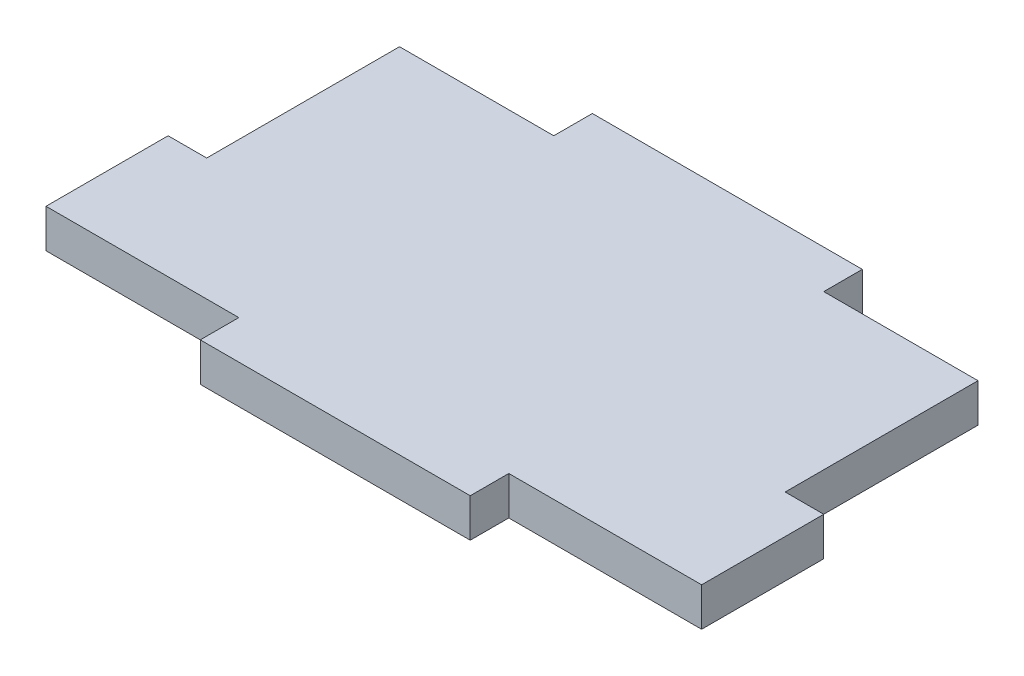
ISO-10303-21;
HEADER;
FILE_DESCRIPTION(('STEP AP214'),'2;1');
FILE_NAME('part.step','',(''),(''),'','','');
FILE_SCHEMA(('AUTOMOTIVE_DESIGN { 1 0 10303 214 1 1 1 1 }'));
ENDSEC;
DATA;
#1=APPLICATION_CONTEXT('core data for automotive mechanical design processes');
#2=APPLICATION_PROTOCOL_DEFINITION('international standard','automotive_design',2000,#1);
#3=PRODUCT_CONTEXT('',#1,'mechanical');
#4=PRODUCT('Part','Part','',(#3));
#5=PRODUCT_RELATED_PRODUCT_CATEGORY('part','',(#4));
#6=PRODUCT_DEFINITION_FORMATION('','',#4);
#7=PRODUCT_DEFINITION_CONTEXT('part definition',#1,'design');
#8=PRODUCT_DEFINITION('design','',#6,#7);
#9=PRODUCT_DEFINITION_SHAPE('','',#8);
#10=(LENGTH_UNIT() NAMED_UNIT(*) SI_UNIT(.MILLI.,.METRE.));
#11=(NAMED_UNIT(*) PLANE_ANGLE_UNIT() SI_UNIT($,.RADIAN.));
#12=(NAMED_UNIT(*) SI_UNIT($,.STERADIAN.) SOLID_ANGLE_UNIT());
#13=UNCERTAINTY_MEASURE_WITH_UNIT(LENGTH_MEASURE(1.E-05),#10,'distance_accuracy_value','');
#14=(GEOMETRIC_REPRESENTATION_CONTEXT(3) GLOBAL_UNCERTAINTY_ASSIGNED_CONTEXT((#13)) GLOBAL_UNIT_ASSIGNED_CONTEXT((#10,
#11,#12)) REPRESENTATION_CONTEXT('',''));
#15=CARTESIAN_POINT('',(0.,0.,0.));
#16=DIRECTION('',(0.,0.,1.));
#17=DIRECTION('',(1.,0.,0.));
#18=AXIS2_PLACEMENT_3D('',#15,#16,#17);
#19=CARTESIAN_POINT('',(-50.,150.,75.));
#20=DIRECTION('',(1.,0.,0.));
#21=DIRECTION('',(0.,0.,-1.));
#22=AXIS2_PLACEMENT_3D('',#19,#20,#21);
#23=PLANE('',#22);
#24=DIRECTION('',(0.,-1.,0.));
#25=VECTOR('',#24,1.);
#26=CARTESIAN_POINT('',(-50.,0.,-39.));
#27=LINE('',#26,#25);
#28=CARTESIAN_POINT('',(-50.,6.,-39.));
#29=VERTEX_POINT('',#28);
#30=CARTESIAN_POINT('',(-50.,0.,-39.));
#31=VERTEX_POINT('',#30);
#32=EDGE_CURVE('E161',#29,#31,#27,.T.);
#33=ORIENTED_EDGE('',*,*,#32,.T.);
#34=DIRECTION('',(0.,0.,1.));
#35=VECTOR('',#34,1.);
#36=CARTESIAN_POINT('',(-50.,0.,75.));
#37=LINE('',#36,#35);
#38=CARTESIAN_POINT('',(-50.,0.,-20.));
#39=VERTEX_POINT('',#38);
#40=EDGE_CURVE('E11',#31,#39,#37,.T.);
#41=ORIENTED_EDGE('',*,*,#40,.T.);
#42=DIRECTION('',(0.,1.,0.));
#43=VECTOR('',#42,1.);
#44=CARTESIAN_POINT('',(-50.,150.,-20.));
#45=LINE('',#44,#43);
#46=CARTESIAN_POINT('',(-50.,6.,-20.));
#47=VERTEX_POINT('',#46);
#48=EDGE_CURVE('E207',#39,#47,#45,.T.);
#49=ORIENTED_EDGE('',*,*,#48,.T.);
#50=DIRECTION('',(0.,0.,1.));
#51=VECTOR('',#50,1.);
#52=CARTESIAN_POINT('',(-50.,6.,-75.));
#53=LINE('',#52,#51);
#54=EDGE_CURVE('E198',#29,#47,#53,.T.);
#55=ORIENTED_EDGE('',*,*,#54,.F.);
#56=EDGE_LOOP('',(#33,#41,#49,#55));
#57=FACE_BOUND('',#56,.T.);
#58=ADVANCED_FACE('F41',(#57),#23,.F.);
#59=CARTESIAN_POINT('',(0.,0.,0.));
#60=DIRECTION('',(0.,-1.,0.));
#61=DIRECTION('',(0.,0.,-1.));
#62=AXIS2_PLACEMENT_3D('',#59,#60,#61);
#63=PLANE('',#62);
#64=ORIENTED_EDGE('',*,*,#40,.F.);
#65=DIRECTION('',(-1.,0.,0.));
#66=VECTOR('',#65,1.);
#67=CARTESIAN_POINT('',(-44.,0.,-39.));
#68=LINE('',#67,#66);
#69=CARTESIAN_POINT('',(-44.,0.,-39.));
#70=VERTEX_POINT('',#69);
#71=EDGE_CURVE('E169',#70,#31,#68,.T.);
#72=ORIENTED_EDGE('',*,*,#71,.F.);
#73=DIRECTION('',(0.,0.,-1.));
#74=VECTOR('',#73,1.);
#75=CARTESIAN_POINT('',(-44.,0.,-69.));
#76=LINE('',#75,#74);
#77=CARTESIAN_POINT('',(-44.,0.,-69.));
#78=VERTEX_POINT('',#77);
#79=EDGE_CURVE('E156',#70,#78,#76,.T.);
#80=ORIENTED_EDGE('',*,*,#79,.T.);
#81=DIRECTION('',(-1.,0.,0.));
#82=VECTOR('',#81,1.);
#83=CARTESIAN_POINT('',(-50.,0.,-69.));
#84=LINE('',#83,#82);
#85=CARTESIAN_POINT('',(-20.,0.,-69.));
#86=VERTEX_POINT('',#85);
#87=EDGE_CURVE('E168',#86,#78,#84,.T.);
#88=ORIENTED_EDGE('',*,*,#87,.F.);
#89=DIRECTION('',(0.,0.,-1.));
#90=VECTOR('',#89,1.);
#91=CARTESIAN_POINT('',(-20.,0.,-69.));
#92=LINE('',#91,#90);
#93=CARTESIAN_POINT('',(-20.,0.,-75.));
#94=VERTEX_POINT('',#93);
#95=EDGE_CURVE('E178',#86,#94,#92,.T.);
#96=ORIENTED_EDGE('',*,*,#95,.T.);
#97=DIRECTION('',(-1.,0.,0.));
#98=VECTOR('',#97,1.);
#99=CARTESIAN_POINT('',(-50.,0.,-75.));
#100=LINE('',#99,#98);
#101=CARTESIAN_POINT('',(22.,0.,-75.));
#102=VERTEX_POINT('',#101);
#103=EDGE_CURVE('E49',#102,#94,#100,.T.);
#104=ORIENTED_EDGE('',*,*,#103,.F.);
#105=DIRECTION('',(0.,0.,-1.));
#106=VECTOR('',#105,1.);
#107=CARTESIAN_POINT('',(22.,0.,-69.));
#108=LINE('',#107,#106);
#109=CARTESIAN_POINT('',(22.,0.,-69.));
#110=VERTEX_POINT('',#109);
#111=EDGE_CURVE('E220',#110,#102,#108,.T.);
#112=ORIENTED_EDGE('',*,*,#111,.F.);
#113=DIRECTION('',(-1.,0.,0.));
#114=VECTOR('',#113,1.);
#115=CARTESIAN_POINT('',(52.,0.,-69.));
#116=LINE('',#115,#114);
#117=CARTESIAN_POINT('',(46.,0.,-69.));
#118=VERTEX_POINT('',#117);
#119=EDGE_CURVE('E238',#118,#110,#116,.T.);
#120=ORIENTED_EDGE('',*,*,#119,.F.);
#121=DIRECTION('',(0.,0.,-1.));
#122=VECTOR('',#121,1.);
#123=CARTESIAN_POINT('',(46.,0.,-69.));
#124=LINE('',#123,#122);
#125=CARTESIAN_POINT('',(46.,0.,-39.));
#126=VERTEX_POINT('',#125);
#127=EDGE_CURVE('E64',#126,#118,#124,.T.);
#128=ORIENTED_EDGE('',*,*,#127,.F.);
#129=DIRECTION('',(1.,0.,0.));
#130=VECTOR('',#129,1.);
#131=CARTESIAN_POINT('',(46.,0.,-39.));
#132=LINE('',#131,#130);
#133=CARTESIAN_POINT('',(52.,0.,-39.));
#134=VERTEX_POINT('',#133);
#135=EDGE_CURVE('E262',#126,#134,#132,.T.);
#136=ORIENTED_EDGE('',*,*,#135,.T.);
#137=DIRECTION('',(0.,0.,-1.));
#138=VECTOR('',#137,1.);
#139=CARTESIAN_POINT('',(52.,0.,-20.));
#140=LINE('',#139,#138);
#141=CARTESIAN_POINT('',(52.,0.,-20.));
#142=VERTEX_POINT('',#141);
#143=EDGE_CURVE('E192',#142,#134,#140,.T.);
#144=ORIENTED_EDGE('',*,*,#143,.F.);
#145=DIRECTION('',(1.,0.,0.));
#146=VECTOR('',#145,1.);
#147=CARTESIAN_POINT('',(-50.001,0.,-20.));
#148=LINE('',#147,#146);
#149=CARTESIAN_POINT('',(22.,0.,-20.));
#150=VERTEX_POINT('',#149);
#151=EDGE_CURVE('E210',#150,#142,#148,.T.);
#152=ORIENTED_EDGE('',*,*,#151,.F.);
#153=DIRECTION('',(0.,0.,-1.));
#154=VECTOR('',#153,1.);
#155=CARTESIAN_POINT('',(22.,0.,-14.));
#156=LINE('',#155,#154);
#157=CARTESIAN_POINT('',(22.,0.,-14.));
#158=VERTEX_POINT('',#157);
#159=EDGE_CURVE('E245',#158,#150,#156,.T.);
#160=ORIENTED_EDGE('',*,*,#159,.F.);
#161=DIRECTION('',(1.,0.,0.));
#162=VECTOR('',#161,1.);
#163=CARTESIAN_POINT('',(-20.,0.,-14.));
#164=LINE('',#163,#162);
#165=CARTESIAN_POINT('',(-20.,0.,-14.));
#166=VERTEX_POINT('',#165);
#167=EDGE_CURVE('E266',#166,#158,#164,.T.);
#168=ORIENTED_EDGE('',*,*,#167,.F.);
#169=DIRECTION('',(0.,0.,-1.));
#170=VECTOR('',#169,1.);
#171=CARTESIAN_POINT('',(-20.,0.,-14.));
#172=LINE('',#171,#170);
#173=CARTESIAN_POINT('',(-20.,0.,-20.));
#174=VERTEX_POINT('',#173);
#175=EDGE_CURVE('E186',#166,#174,#172,.T.);
#176=ORIENTED_EDGE('',*,*,#175,.T.);
#177=EDGE_CURVE('E211',#39,#174,#148,.T.);
#178=ORIENTED_EDGE('',*,*,#177,.F.);
#179=EDGE_LOOP('',(#64,#72,#80,#88,#96,#104,#112,#120,#128,#136,#144,#152,#160,#168,#176,#178));
#180=FACE_BOUND('',#179,.T.);
#181=ADVANCED_FACE('F166',(#180),#63,.T.);
#182=CARTESIAN_POINT('',(0.,6.,0.));
#183=DIRECTION('',(0.,1.,0.));
#184=DIRECTION('',(0.,0.,1.));
#185=AXIS2_PLACEMENT_3D('',#182,#183,#184);
#186=PLANE('',#185);
#187=DIRECTION('',(0.,0.,1.));
#188=VECTOR('',#187,1.);
#189=CARTESIAN_POINT('',(-44.,6.,-69.));
#190=LINE('',#189,#188);
#191=CARTESIAN_POINT('',(-44.,6.,-69.));
#192=VERTEX_POINT('',#191);
#193=CARTESIAN_POINT('',(-44.,6.,-39.));
#194=VERTEX_POINT('',#193);
#195=EDGE_CURVE('E56',#192,#194,#190,.T.);
#196=ORIENTED_EDGE('',*,*,#195,.T.);
#197=DIRECTION('',(-1.,0.,0.));
#198=VECTOR('',#197,1.);
#199=CARTESIAN_POINT('',(-44.,6.,-39.));
#200=LINE('',#199,#198);
#201=EDGE_CURVE('E277',#194,#29,#200,.T.);
#202=ORIENTED_EDGE('',*,*,#201,.T.);
#203=ORIENTED_EDGE('',*,*,#54,.T.);
#204=DIRECTION('',(1.,0.,0.));
#205=VECTOR('',#204,1.);
#206=CARTESIAN_POINT('',(-50.,6.,-20.));
#207=LINE('',#206,#205);
#208=CARTESIAN_POINT('',(-20.,6.,-20.));
#209=VERTEX_POINT('',#208);
#210=EDGE_CURVE('E201',#47,#209,#207,.T.);
#211=ORIENTED_EDGE('',*,*,#210,.T.);
#212=DIRECTION('',(0.,0.,-1.));
#213=VECTOR('',#212,1.);
#214=CARTESIAN_POINT('',(-20.,6.,-14.));
#215=LINE('',#214,#213);
#216=CARTESIAN_POINT('',(-20.,6.,-14.));
#217=VERTEX_POINT('',#216);
#218=EDGE_CURVE('E251',#217,#209,#215,.T.);
#219=ORIENTED_EDGE('',*,*,#218,.F.);
#220=DIRECTION('',(-1.,0.,0.));
#221=VECTOR('',#220,1.);
#222=CARTESIAN_POINT('',(-20.,6.,-14.));
#223=LINE('',#222,#221);
#224=CARTESIAN_POINT('',(22.,6.,-14.));
#225=VERTEX_POINT('',#224);
#226=EDGE_CURVE('E254',#225,#217,#223,.T.);
#227=ORIENTED_EDGE('',*,*,#226,.F.);
#228=DIRECTION('',(0.,0.,-1.));
#229=VECTOR('',#228,1.);
#230=CARTESIAN_POINT('',(22.,6.,-14.));
#231=LINE('',#230,#229);
#232=CARTESIAN_POINT('',(22.,6.,-20.));
#233=VERTEX_POINT('',#232);
#234=EDGE_CURVE('E248',#225,#233,#231,.T.);
#235=ORIENTED_EDGE('',*,*,#234,.T.);
#236=CARTESIAN_POINT('',(52.,6.,-20.));
#237=VERTEX_POINT('',#236);
#238=EDGE_CURVE('E200',#233,#237,#207,.T.);
#239=ORIENTED_EDGE('',*,*,#238,.T.);
#240=DIRECTION('',(0.,0.,1.));
#241=VECTOR('',#240,1.);
#242=CARTESIAN_POINT('',(52.,6.,-20.));
#243=LINE('',#242,#241);
#244=CARTESIAN_POINT('',(52.,6.,-39.));
#245=VERTEX_POINT('',#244);
#246=EDGE_CURVE('E196',#245,#237,#243,.T.);
#247=ORIENTED_EDGE('',*,*,#246,.F.);
#248=DIRECTION('',(1.,0.,0.));
#249=VECTOR('',#248,1.);
#250=CARTESIAN_POINT('',(46.,6.,-39.));
#251=LINE('',#250,#249);
#252=CARTESIAN_POINT('',(46.,6.,-39.));
#253=VERTEX_POINT('',#252);
#254=EDGE_CURVE('E270',#253,#245,#251,.T.);
#255=ORIENTED_EDGE('',*,*,#254,.F.);
#256=DIRECTION('',(0.,0.,1.));
#257=VECTOR('',#256,1.);
#258=CARTESIAN_POINT('',(46.,6.,-69.));
#259=LINE('',#258,#257);
#260=CARTESIAN_POINT('',(46.,6.,-69.));
#261=VERTEX_POINT('',#260);
#262=EDGE_CURVE('E281',#261,#253,#259,.T.);
#263=ORIENTED_EDGE('',*,*,#262,.F.);
#264=DIRECTION('',(1.,0.,0.));
#265=VECTOR('',#264,1.);
#266=CARTESIAN_POINT('',(52.,6.,-69.));
#267=LINE('',#266,#265);
#268=CARTESIAN_POINT('',(22.,6.,-69.));
#269=VERTEX_POINT('',#268);
#270=EDGE_CURVE('E230',#269,#261,#267,.T.);
#271=ORIENTED_EDGE('',*,*,#270,.F.);
#272=DIRECTION('',(0.,0.,-1.));
#273=VECTOR('',#272,1.);
#274=CARTESIAN_POINT('',(22.,6.,-69.));
#275=LINE('',#274,#273);
#276=CARTESIAN_POINT('',(22.,6.,-75.));
#277=VERTEX_POINT('',#276);
#278=EDGE_CURVE('E193',#269,#277,#275,.T.);
#279=ORIENTED_EDGE('',*,*,#278,.T.);
#280=DIRECTION('',(-1.,0.,0.));
#281=VECTOR('',#280,1.);
#282=CARTESIAN_POINT('',(-50.,6.,-75.));
#283=LINE('',#282,#281);
#284=CARTESIAN_POINT('',(-20.,6.,-75.));
#285=VERTEX_POINT('',#284);
#286=EDGE_CURVE('E204',#277,#285,#283,.T.);
#287=ORIENTED_EDGE('',*,*,#286,.T.);
#288=DIRECTION('',(0.,0.,-1.));
#289=VECTOR('',#288,1.);
#290=CARTESIAN_POINT('',(-20.,6.,-69.));
#291=LINE('',#290,#289);
#292=CARTESIAN_POINT('',(-20.,6.,-69.));
#293=VERTEX_POINT('',#292);
#294=EDGE_CURVE('E176',#293,#285,#291,.T.);
#295=ORIENTED_EDGE('',*,*,#294,.F.);
#296=DIRECTION('',(1.,0.,0.));
#297=VECTOR('',#296,1.);
#298=CARTESIAN_POINT('',(-50.,6.,-69.));
#299=LINE('',#298,#297);
#300=EDGE_CURVE('E180',#192,#293,#299,.T.);
#301=ORIENTED_EDGE('',*,*,#300,.F.);
#302=EDGE_LOOP('',(#196,#202,#203,#211,#219,#227,#235,#239,#247,#255,#263,#271,#279,#287,#295,#301));
#303=FACE_BOUND('',#302,.T.);
#304=ADVANCED_FACE('F225',(#303),#186,.T.);
#305=CARTESIAN_POINT('',(0.,0.,-69.));
#306=DIRECTION('',(0.,0.,-1.));
#307=DIRECTION('',(-1.,0.,0.));
#308=AXIS2_PLACEMENT_3D('',#305,#306,#307);
#309=PLANE('',#308);
#310=ORIENTED_EDGE('',*,*,#87,.T.);
#311=DIRECTION('',(0.,1.,0.));
#312=VECTOR('',#311,1.);
#313=CARTESIAN_POINT('',(-44.,0.,-69.));
#314=LINE('',#313,#312);
#315=EDGE_CURVE('E153',#78,#192,#314,.T.);
#316=ORIENTED_EDGE('',*,*,#315,.T.);
#317=ORIENTED_EDGE('',*,*,#300,.T.);
#318=DIRECTION('',(0.,-1.,0.));
#319=VECTOR('',#318,1.);
#320=CARTESIAN_POINT('',(-20.,0.,-69.));
#321=LINE('',#320,#319);
#322=EDGE_CURVE('E175',#293,#86,#321,.T.);
#323=ORIENTED_EDGE('',*,*,#322,.T.);
#324=EDGE_LOOP('',(#310,#316,#317,#323));
#325=FACE_BOUND('',#324,.T.);
#326=ADVANCED_FACE('F173',(#325),#309,.T.);
#327=CARTESIAN_POINT('',(0.,0.,-69.));
#328=DIRECTION('',(0.,0.,-1.));
#329=DIRECTION('',(-1.,0.,0.));
#330=AXIS2_PLACEMENT_3D('',#327,#328,#329);
#331=PLANE('',#330);
#332=ORIENTED_EDGE('',*,*,#270,.T.);
#333=DIRECTION('',(0.,1.,0.));
#334=VECTOR('',#333,1.);
#335=CARTESIAN_POINT('',(46.,0.,-69.));
#336=LINE('',#335,#334);
#337=EDGE_CURVE('E276',#118,#261,#336,.T.);
#338=ORIENTED_EDGE('',*,*,#337,.F.);
#339=ORIENTED_EDGE('',*,*,#119,.T.);
#340=DIRECTION('',(0.,1.,0.));
#341=VECTOR('',#340,1.);
#342=CARTESIAN_POINT('',(22.,6.,-69.));
#343=LINE('',#342,#341);
#344=EDGE_CURVE('E240',#110,#269,#343,.T.);
#345=ORIENTED_EDGE('',*,*,#344,.T.);
#346=EDGE_LOOP('',(#332,#338,#339,#345));
#347=FACE_BOUND('',#346,.T.);
#348=ADVANCED_FACE('F328',(#347),#331,.T.);
#349=CARTESIAN_POINT('',(50.,0.,-20.));
#350=DIRECTION('',(0.,0.,-1.));
#351=DIRECTION('',(-1.,0.,0.));
#352=AXIS2_PLACEMENT_3D('',#349,#350,#351);
#353=PLANE('',#352);
#354=DIRECTION('',(0.,-1.,0.));
#355=VECTOR('',#354,1.);
#356=CARTESIAN_POINT('',(-20.,0.,-20.));
#357=LINE('',#356,#355);
#358=EDGE_CURVE('E259',#209,#174,#357,.T.);
#359=ORIENTED_EDGE('',*,*,#358,.F.);
#360=ORIENTED_EDGE('',*,*,#210,.F.);
#361=ORIENTED_EDGE('',*,*,#48,.F.);
#362=ORIENTED_EDGE('',*,*,#177,.T.);
#363=EDGE_LOOP('',(#359,#360,#361,#362));
#364=FACE_BOUND('',#363,.T.);
#365=ADVANCED_FACE('F299',(#364),#353,.F.);
#366=DIRECTION('',(0.,1.,0.));
#367=VECTOR('',#366,1.);
#368=CARTESIAN_POINT('',(22.,0.,-20.));
#369=LINE('',#368,#367);
#370=EDGE_CURVE('E255',#150,#233,#369,.T.);
#371=ORIENTED_EDGE('',*,*,#370,.F.);
#372=ORIENTED_EDGE('',*,*,#151,.T.);
#373=DIRECTION('',(0.,-1.,0.));
#374=VECTOR('',#373,1.);
#375=CARTESIAN_POINT('',(52.,6.,-20.));
#376=LINE('',#375,#374);
#377=EDGE_CURVE('E189',#237,#142,#376,.T.);
#378=ORIENTED_EDGE('',*,*,#377,.F.);
#379=ORIENTED_EDGE('',*,*,#238,.F.);
#380=EDGE_LOOP('',(#371,#372,#378,#379));
#381=FACE_BOUND('',#380,.T.);
#382=ADVANCED_FACE('F318',(#381),#353,.F.);
#383=CARTESIAN_POINT('',(52.,0.,0.));
#384=DIRECTION('',(1.,0.,0.));
#385=DIRECTION('',(0.,0.,-1.));
#386=AXIS2_PLACEMENT_3D('',#383,#384,#385);
#387=PLANE('',#386);
#388=DIRECTION('',(0.,-1.,0.));
#389=VECTOR('',#388,1.);
#390=CARTESIAN_POINT('',(52.,0.,-39.));
#391=LINE('',#390,#389);
#392=EDGE_CURVE('E274',#245,#134,#391,.T.);
#393=ORIENTED_EDGE('',*,*,#392,.F.);
#394=ORIENTED_EDGE('',*,*,#246,.T.);
#395=ORIENTED_EDGE('',*,*,#377,.T.);
#396=ORIENTED_EDGE('',*,*,#143,.T.);
#397=EDGE_LOOP('',(#393,#394,#395,#396));
#398=FACE_BOUND('',#397,.T.);
#399=ADVANCED_FACE('F322',(#398),#387,.T.);
#400=CARTESIAN_POINT('',(-50.,150.,-75.));
#401=DIRECTION('',(0.,0.,1.));
#402=DIRECTION('',(1.,0.,0.));
#403=AXIS2_PLACEMENT_3D('',#400,#401,#402);
#404=PLANE('',#403);
#405=ORIENTED_EDGE('',*,*,#286,.F.);
#406=DIRECTION('',(0.,1.,0.));
#407=VECTOR('',#406,1.);
#408=CARTESIAN_POINT('',(22.,6.,-75.));
#409=LINE('',#408,#407);
#410=EDGE_CURVE('E187',#102,#277,#409,.T.);
#411=ORIENTED_EDGE('',*,*,#410,.F.);
#412=ORIENTED_EDGE('',*,*,#103,.T.);
#413=DIRECTION('',(0.,-1.,0.));
#414=VECTOR('',#413,1.);
#415=CARTESIAN_POINT('',(-20.,0.,-75.));
#416=LINE('',#415,#414);
#417=EDGE_CURVE('E184',#285,#94,#416,.T.);
#418=ORIENTED_EDGE('',*,*,#417,.F.);
#419=EDGE_LOOP('',(#405,#411,#412,#418));
#420=FACE_BOUND('',#419,.T.);
#421=ADVANCED_FACE('F43',(#420),#404,.F.);
#422=CARTESIAN_POINT('',(22.,6.,-69.));
#423=DIRECTION('',(-1.,0.,0.));
#424=DIRECTION('',(0.,0.,1.));
#425=AXIS2_PLACEMENT_3D('',#422,#423,#424);
#426=PLANE('',#425);
#427=ORIENTED_EDGE('',*,*,#410,.T.);
#428=ORIENTED_EDGE('',*,*,#278,.F.);
#429=ORIENTED_EDGE('',*,*,#344,.F.);
#430=ORIENTED_EDGE('',*,*,#111,.T.);
#431=EDGE_LOOP('',(#427,#428,#429,#430));
#432=FACE_BOUND('',#431,.T.);
#433=ADVANCED_FACE('F329',(#432),#426,.F.);
#434=CARTESIAN_POINT('',(-20.,0.,-69.));
#435=DIRECTION('',(1.,0.,0.));
#436=DIRECTION('',(0.,0.,-1.));
#437=AXIS2_PLACEMENT_3D('',#434,#435,#436);
#438=PLANE('',#437);
#439=ORIENTED_EDGE('',*,*,#417,.T.);
#440=ORIENTED_EDGE('',*,*,#95,.F.);
#441=ORIENTED_EDGE('',*,*,#322,.F.);
#442=ORIENTED_EDGE('',*,*,#294,.T.);
#443=EDGE_LOOP('',(#439,#440,#441,#442));
#444=FACE_BOUND('',#443,.T.);
#445=ADVANCED_FACE('F222',(#444),#438,.F.);
#446=CARTESIAN_POINT('',(-20.,0.,-14.));
#447=DIRECTION('',(1.,0.,0.));
#448=DIRECTION('',(0.,0.,-1.));
#449=AXIS2_PLACEMENT_3D('',#446,#447,#448);
#450=PLANE('',#449);
#451=ORIENTED_EDGE('',*,*,#358,.T.);
#452=ORIENTED_EDGE('',*,*,#175,.F.);
#453=DIRECTION('',(0.,-1.,0.));
#454=VECTOR('',#453,1.);
#455=CARTESIAN_POINT('',(-20.,0.,-14.));
#456=LINE('',#455,#454);
#457=EDGE_CURVE('E258',#217,#166,#456,.T.);
#458=ORIENTED_EDGE('',*,*,#457,.F.);
#459=ORIENTED_EDGE('',*,*,#218,.T.);
#460=EDGE_LOOP('',(#451,#452,#458,#459));
#461=FACE_BOUND('',#460,.T.);
#462=ADVANCED_FACE('F304',(#461),#450,.F.);
#463=CARTESIAN_POINT('',(22.,0.,-14.));
#464=DIRECTION('',(-1.,0.,0.));
#465=DIRECTION('',(0.,0.,1.));
#466=AXIS2_PLACEMENT_3D('',#463,#464,#465);
#467=PLANE('',#466);
#468=ORIENTED_EDGE('',*,*,#370,.T.);
#469=ORIENTED_EDGE('',*,*,#234,.F.);
#470=DIRECTION('',(0.,1.,0.));
#471=VECTOR('',#470,1.);
#472=CARTESIAN_POINT('',(22.,0.,-14.));
#473=LINE('',#472,#471);
#474=EDGE_CURVE('E264',#158,#225,#473,.T.);
#475=ORIENTED_EDGE('',*,*,#474,.F.);
#476=ORIENTED_EDGE('',*,*,#159,.T.);
#477=EDGE_LOOP('',(#468,#469,#475,#476));
#478=FACE_BOUND('',#477,.T.);
#479=ADVANCED_FACE('F315',(#478),#467,.F.);
#480=CARTESIAN_POINT('',(0.,0.,-14.));
#481=DIRECTION('',(0.,0.,-1.));
#482=DIRECTION('',(-1.,0.,0.));
#483=AXIS2_PLACEMENT_3D('',#480,#481,#482);
#484=PLANE('',#483);
#485=ORIENTED_EDGE('',*,*,#457,.T.);
#486=ORIENTED_EDGE('',*,*,#167,.T.);
#487=ORIENTED_EDGE('',*,*,#474,.T.);
#488=ORIENTED_EDGE('',*,*,#226,.T.);
#489=EDGE_LOOP('',(#485,#486,#487,#488));
#490=FACE_BOUND('',#489,.T.);
#491=ADVANCED_FACE('F307',(#490),#484,.F.);
#492=CARTESIAN_POINT('',(46.,0.,-39.));
#493=DIRECTION('',(0.,0.,1.));
#494=DIRECTION('',(1.,0.,0.));
#495=AXIS2_PLACEMENT_3D('',#492,#493,#494);
#496=PLANE('',#495);
#497=ORIENTED_EDGE('',*,*,#392,.T.);
#498=ORIENTED_EDGE('',*,*,#135,.F.);
#499=DIRECTION('',(0.,-1.,0.));
#500=VECTOR('',#499,1.);
#501=CARTESIAN_POINT('',(46.,0.,-39.));
#502=LINE('',#501,#500);
#503=EDGE_CURVE('E279',#253,#126,#502,.T.);
#504=ORIENTED_EDGE('',*,*,#503,.F.);
#505=ORIENTED_EDGE('',*,*,#254,.T.);
#506=EDGE_LOOP('',(#497,#498,#504,#505));
#507=FACE_BOUND('',#506,.T.);
#508=ADVANCED_FACE('F325',(#507),#496,.F.);
#509=CARTESIAN_POINT('',(46.,0.,0.));
#510=DIRECTION('',(1.,0.,0.));
#511=DIRECTION('',(0.,0.,-1.));
#512=AXIS2_PLACEMENT_3D('',#509,#510,#511);
#513=PLANE('',#512);
#514=ORIENTED_EDGE('',*,*,#337,.T.);
#515=ORIENTED_EDGE('',*,*,#262,.T.);
#516=ORIENTED_EDGE('',*,*,#503,.T.);
#517=ORIENTED_EDGE('',*,*,#127,.T.);
#518=EDGE_LOOP('',(#514,#515,#516,#517));
#519=FACE_BOUND('',#518,.T.);
#520=ADVANCED_FACE('F326',(#519),#513,.T.);
#521=CARTESIAN_POINT('',(-44.,0.,-39.));
#522=DIRECTION('',(0.,0.,-1.));
#523=DIRECTION('',(-1.,0.,0.));
#524=AXIS2_PLACEMENT_3D('',#521,#522,#523);
#525=PLANE('',#524);
#526=ORIENTED_EDGE('',*,*,#32,.F.);
#527=ORIENTED_EDGE('',*,*,#201,.F.);
#528=DIRECTION('',(0.,-1.,0.));
#529=VECTOR('',#528,1.);
#530=CARTESIAN_POINT('',(-44.,0.,-39.));
#531=LINE('',#530,#529);
#532=EDGE_CURVE('E170',#194,#70,#531,.T.);
#533=ORIENTED_EDGE('',*,*,#532,.T.);
#534=ORIENTED_EDGE('',*,*,#71,.T.);
#535=EDGE_LOOP('',(#526,#527,#533,#534));
#536=FACE_BOUND('',#535,.T.);
#537=ADVANCED_FACE('F292',(#536),#525,.T.);
#538=CARTESIAN_POINT('',(-44.,0.,0.));
#539=DIRECTION('',(-1.,0.,0.));
#540=DIRECTION('',(0.,0.,-1.));
#541=AXIS2_PLACEMENT_3D('',#538,#539,#540);
#542=PLANE('',#541);
#543=ORIENTED_EDGE('',*,*,#315,.F.);
#544=ORIENTED_EDGE('',*,*,#79,.F.);
#545=ORIENTED_EDGE('',*,*,#532,.F.);
#546=ORIENTED_EDGE('',*,*,#195,.F.);
#547=EDGE_LOOP('',(#543,#544,#545,#546));
#548=FACE_BOUND('',#547,.T.);
#549=ADVANCED_FACE('F155',(#548),#542,.T.);
#550=CLOSED_SHELL('',(#58,#181,#304,#326,#348,#365,#382,#399,#421,#433,#445,#462,#479,#491,#508,
#520,#537,#549));
#551=MANIFOLD_SOLID_BREP('B2',#550);
#552=ADVANCED_BREP_SHAPE_REPRESENTATION('',(#18,#551),#14);
#553=SHAPE_DEFINITION_REPRESENTATION(#9,#552);
ENDSEC;
END-ISO-10303-21;
